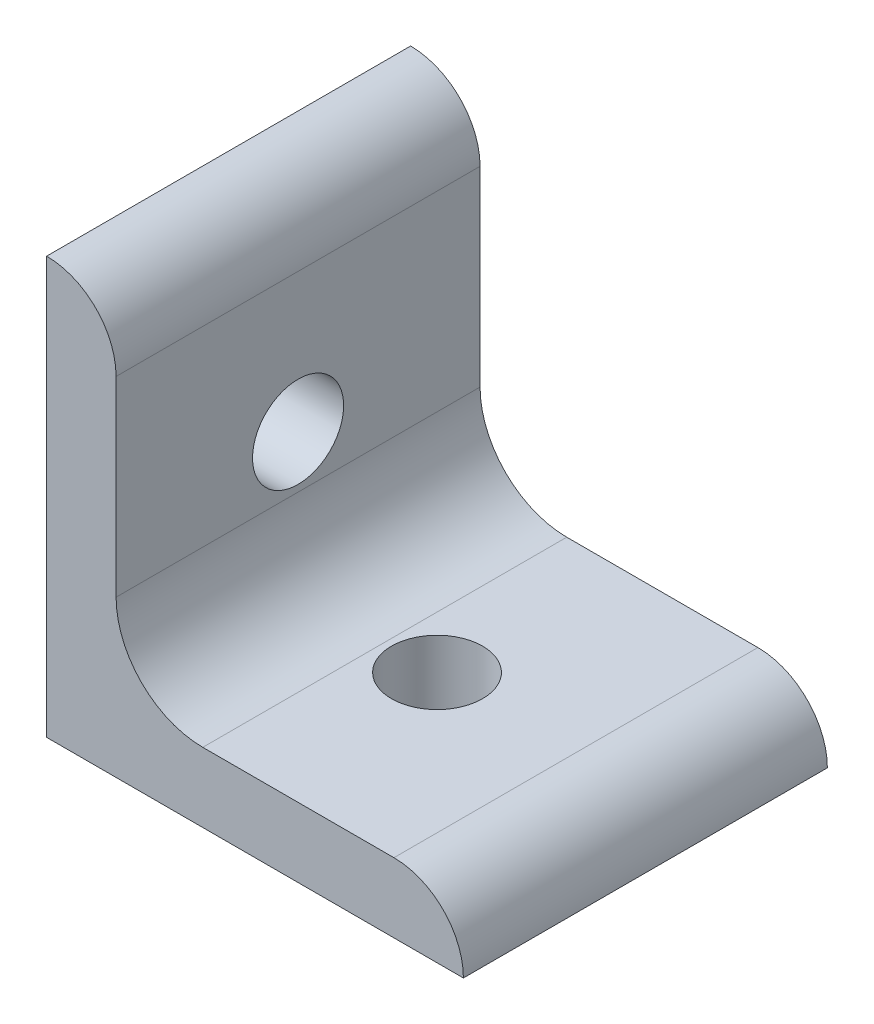
ISO-10303-21;
HEADER;
FILE_DESCRIPTION(('STEP AP214'),'2;1');
FILE_NAME('part.step','',(''),(''),'','','');
FILE_SCHEMA(('AUTOMOTIVE_DESIGN { 1 0 10303 214 1 1 1 1 }'));
ENDSEC;
DATA;
#1=APPLICATION_CONTEXT('core data for automotive mechanical design processes');
#2=APPLICATION_PROTOCOL_DEFINITION('international standard','automotive_design',2000,#1);
#3=PRODUCT_CONTEXT('',#1,'mechanical');
#4=PRODUCT('Part','Part','',(#3));
#5=PRODUCT_RELATED_PRODUCT_CATEGORY('part','',(#4));
#6=PRODUCT_DEFINITION_FORMATION('','',#4);
#7=PRODUCT_DEFINITION_CONTEXT('part definition',#1,'design');
#8=PRODUCT_DEFINITION('design','',#6,#7);
#9=PRODUCT_DEFINITION_SHAPE('','',#8);
#10=(LENGTH_UNIT() NAMED_UNIT(*) SI_UNIT(.MILLI.,.METRE.));
#11=(NAMED_UNIT(*) PLANE_ANGLE_UNIT() SI_UNIT($,.RADIAN.));
#12=(NAMED_UNIT(*) SI_UNIT($,.STERADIAN.) SOLID_ANGLE_UNIT());
#13=UNCERTAINTY_MEASURE_WITH_UNIT(LENGTH_MEASURE(1.E-05),#10,'distance_accuracy_value','');
#14=(GEOMETRIC_REPRESENTATION_CONTEXT(3) GLOBAL_UNCERTAINTY_ASSIGNED_CONTEXT((#13)) GLOBAL_UNIT_ASSIGNED_CONTEXT((#10,
#11,#12)) REPRESENTATION_CONTEXT('',''));
#15=CARTESIAN_POINT('',(0.,0.,0.));
#16=DIRECTION('',(0.,0.,1.));
#17=DIRECTION('',(1.,0.,0.));
#18=AXIS2_PLACEMENT_3D('',#15,#16,#17);
#19=CARTESIAN_POINT('',(6.35,31.75,16.637));
#20=DIRECTION('',(-1.,0.,0.));
#21=DIRECTION('',(0.,-1.,0.));
#22=AXIS2_PLACEMENT_3D('',#19,#20,#21);
#23=PLANE('',#22);
#24=DIRECTION('',(0.,1.,0.));
#25=VECTOR('',#24,1.);
#26=CARTESIAN_POINT('',(6.35,31.75,-16.637));
#27=LINE('',#26,#25);
#28=CARTESIAN_POINT('',(6.35,14.2748,-16.637));
#29=VERTEX_POINT('',#28);
#30=CARTESIAN_POINT('',(6.35,31.75,-16.637));
#31=VERTEX_POINT('',#30);
#32=EDGE_CURVE('E136',#29,#31,#27,.T.);
#33=ORIENTED_EDGE('',*,*,#32,.T.);
#34=DIRECTION('',(0.,0.,-1.));
#35=VECTOR('',#34,1.);
#36=CARTESIAN_POINT('',(6.35,31.75,16.637));
#37=LINE('',#36,#35);
#38=CARTESIAN_POINT('',(6.35,31.75,16.637));
#39=VERTEX_POINT('',#38);
#40=EDGE_CURVE('E133',#39,#31,#37,.T.);
#41=ORIENTED_EDGE('',*,*,#40,.F.);
#42=DIRECTION('',(0.,1.,0.));
#43=VECTOR('',#42,1.);
#44=CARTESIAN_POINT('',(6.35,31.75,16.637));
#45=LINE('',#44,#43);
#46=CARTESIAN_POINT('',(6.35,14.2748,16.637));
#47=VERTEX_POINT('',#46);
#48=EDGE_CURVE('E121',#47,#39,#45,.T.);
#49=ORIENTED_EDGE('',*,*,#48,.F.);
#50=DIRECTION('',(0.,0.,-1.));
#51=VECTOR('',#50,1.);
#52=CARTESIAN_POINT('',(6.35,14.2748,16.637));
#53=LINE('',#52,#51);
#54=EDGE_CURVE('E138',#47,#29,#53,.T.);
#55=ORIENTED_EDGE('',*,*,#54,.T.);
#56=EDGE_LOOP('',(#33,#41,#49,#55));
#57=FACE_BOUND('',#56,.T.);
#58=CARTESIAN_POINT('',(6.34999999999999,19.05,0.));
#59=DIRECTION('',(-1.,0.,0.));
#60=DIRECTION('',(0.,-1.,0.));
#61=AXIS2_PLACEMENT_3D('',#58,#59,#60);
#62=CIRCLE('',#61,4.1656);
#63=CARTESIAN_POINT('',(6.34999999999999,19.05,4.1656));
#64=VERTEX_POINT('',#63);
#65=EDGE_CURVE('E206',#64,#64,#62,.F.);
#66=ORIENTED_EDGE('',*,*,#65,.F.);
#67=EDGE_LOOP('',(#66));
#68=FACE_BOUND('',#67,.T.);
#69=ADVANCED_FACE('F38',(#57,#68),#23,.F.);
#70=CARTESIAN_POINT('',(0.,0.,16.637));
#71=DIRECTION('',(1.,0.,0.));
#72=DIRECTION('',(0.,0.,-1.));
#73=AXIS2_PLACEMENT_3D('',#70,#71,#72);
#74=PLANE('',#73);
#75=DIRECTION('',(0.,-1.,0.));
#76=VECTOR('',#75,1.);
#77=CARTESIAN_POINT('',(0.,0.,-16.637));
#78=LINE('',#77,#76);
#79=CARTESIAN_POINT('',(0.,38.1,-16.637));
#80=VERTEX_POINT('',#79);
#81=CARTESIAN_POINT('',(0.,0.,-16.637));
#82=VERTEX_POINT('',#81);
#83=EDGE_CURVE('E100',#80,#82,#78,.T.);
#84=ORIENTED_EDGE('',*,*,#83,.T.);
#85=DIRECTION('',(0.,0.,-1.));
#86=VECTOR('',#85,1.);
#87=CARTESIAN_POINT('',(0.,0.,16.637));
#88=LINE('',#87,#86);
#89=CARTESIAN_POINT('',(0.,0.,16.637));
#90=VERTEX_POINT('',#89);
#91=EDGE_CURVE('E146',#90,#82,#88,.T.);
#92=ORIENTED_EDGE('',*,*,#91,.F.);
#93=DIRECTION('',(0.,-1.,0.));
#94=VECTOR('',#93,1.);
#95=CARTESIAN_POINT('',(0.,0.,16.637));
#96=LINE('',#95,#94);
#97=CARTESIAN_POINT('',(0.,38.1,16.637));
#98=VERTEX_POINT('',#97);
#99=EDGE_CURVE('E60',#98,#90,#96,.T.);
#100=ORIENTED_EDGE('',*,*,#99,.F.);
#101=DIRECTION('',(0.,0.,-1.));
#102=VECTOR('',#101,1.);
#103=CARTESIAN_POINT('',(0.,38.1,16.637));
#104=LINE('',#103,#102);
#105=EDGE_CURVE('E139',#98,#80,#104,.T.);
#106=ORIENTED_EDGE('',*,*,#105,.T.);
#107=EDGE_LOOP('',(#84,#92,#100,#106));
#108=FACE_BOUND('',#107,.T.);
#109=CARTESIAN_POINT('',(0.,19.05,0.));
#110=DIRECTION('',(1.,0.,0.));
#111=DIRECTION('',(0.,0.,-1.));
#112=AXIS2_PLACEMENT_3D('',#109,#110,#111);
#113=CIRCLE('',#112,4.1656);
#114=CARTESIAN_POINT('',(0.,19.05,4.1656));
#115=VERTEX_POINT('',#114);
#116=EDGE_CURVE('E210',#115,#115,#113,.T.);
#117=ORIENTED_EDGE('',*,*,#116,.T.);
#118=EDGE_LOOP('',(#117));
#119=FACE_BOUND('',#118,.T.);
#120=ADVANCED_FACE('F215',(#108,#119),#74,.F.);
#121=CARTESIAN_POINT('',(38.1,0.,16.637));
#122=DIRECTION('',(0.,1.,0.));
#123=DIRECTION('',(-1.,0.,0.));
#124=AXIS2_PLACEMENT_3D('',#121,#122,#123);
#125=PLANE('',#124);
#126=DIRECTION('',(1.,0.,0.));
#127=VECTOR('',#126,1.);
#128=CARTESIAN_POINT('',(38.1,0.,-16.637));
#129=LINE('',#128,#127);
#130=CARTESIAN_POINT('',(38.1,0.,-16.637));
#131=VERTEX_POINT('',#130);
#132=EDGE_CURVE('E150',#82,#131,#129,.T.);
#133=ORIENTED_EDGE('',*,*,#132,.T.);
#134=DIRECTION('',(0.,0.,-1.));
#135=VECTOR('',#134,1.);
#136=CARTESIAN_POINT('',(38.1,0.,16.637));
#137=LINE('',#136,#135);
#138=CARTESIAN_POINT('',(38.1,0.,16.637));
#139=VERTEX_POINT('',#138);
#140=EDGE_CURVE('E11',#139,#131,#137,.T.);
#141=ORIENTED_EDGE('',*,*,#140,.F.);
#142=DIRECTION('',(1.,0.,0.));
#143=VECTOR('',#142,1.);
#144=CARTESIAN_POINT('',(38.1,0.,16.637));
#145=LINE('',#144,#143);
#146=EDGE_CURVE('E169',#90,#139,#145,.T.);
#147=ORIENTED_EDGE('',*,*,#146,.F.);
#148=ORIENTED_EDGE('',*,*,#91,.T.);
#149=EDGE_LOOP('',(#133,#141,#147,#148));
#150=FACE_BOUND('',#149,.T.);
#151=CARTESIAN_POINT('',(19.05,0.,0.));
#152=DIRECTION('',(0.,1.,0.));
#153=DIRECTION('',(0.,0.,1.));
#154=AXIS2_PLACEMENT_3D('',#151,#152,#153);
#155=CIRCLE('',#154,4.1656);
#156=CARTESIAN_POINT('',(19.05,0.,-4.1656));
#157=VERTEX_POINT('',#156);
#158=EDGE_CURVE('E202',#157,#157,#155,.T.);
#159=ORIENTED_EDGE('',*,*,#158,.T.);
#160=EDGE_LOOP('',(#159));
#161=FACE_BOUND('',#160,.T.);
#162=ADVANCED_FACE('F40',(#150,#161),#125,.F.);
#163=CARTESIAN_POINT('',(14.2748,6.35000000000001,16.637));
#164=DIRECTION('',(0.,-1.,0.));
#165=DIRECTION('',(1.,0.,0.));
#166=AXIS2_PLACEMENT_3D('',#163,#164,#165);
#167=PLANE('',#166);
#168=DIRECTION('',(-1.,0.,0.));
#169=VECTOR('',#168,1.);
#170=CARTESIAN_POINT('',(14.2748,6.35000000000001,-16.637));
#171=LINE('',#170,#169);
#172=CARTESIAN_POINT('',(31.75,6.34999999999999,-16.637));
#173=VERTEX_POINT('',#172);
#174=CARTESIAN_POINT('',(14.2748,6.35000000000001,-16.637));
#175=VERTEX_POINT('',#174);
#176=EDGE_CURVE('E157',#173,#175,#171,.T.);
#177=ORIENTED_EDGE('',*,*,#176,.T.);
#178=DIRECTION('',(0.,0.,-1.));
#179=VECTOR('',#178,1.);
#180=CARTESIAN_POINT('',(14.2748,6.35000000000001,16.637));
#181=LINE('',#180,#179);
#182=CARTESIAN_POINT('',(14.2748,6.35000000000001,16.637));
#183=VERTEX_POINT('',#182);
#184=EDGE_CURVE('E175',#183,#175,#181,.T.);
#185=ORIENTED_EDGE('',*,*,#184,.F.);
#186=DIRECTION('',(-1.,0.,0.));
#187=VECTOR('',#186,1.);
#188=CARTESIAN_POINT('',(14.2748,6.35000000000001,16.637));
#189=LINE('',#188,#187);
#190=CARTESIAN_POINT('',(31.75,6.34999999999999,16.637));
#191=VERTEX_POINT('',#190);
#192=EDGE_CURVE('E188',#191,#183,#189,.T.);
#193=ORIENTED_EDGE('',*,*,#192,.F.);
#194=DIRECTION('',(0.,0.,-1.));
#195=VECTOR('',#194,1.);
#196=CARTESIAN_POINT('',(31.75,6.34999999999999,16.637));
#197=LINE('',#196,#195);
#198=EDGE_CURVE('E49',#191,#173,#197,.T.);
#199=ORIENTED_EDGE('',*,*,#198,.T.);
#200=EDGE_LOOP('',(#177,#185,#193,#199));
#201=FACE_BOUND('',#200,.T.);
#202=CARTESIAN_POINT('',(19.05,6.35000000000001,0.));
#203=DIRECTION('',(0.,-1.,0.));
#204=DIRECTION('',(1.,0.,0.));
#205=AXIS2_PLACEMENT_3D('',#202,#203,#204);
#206=CIRCLE('',#205,4.1656);
#207=CARTESIAN_POINT('',(19.05,6.35000000000001,-4.1656));
#208=VERTEX_POINT('',#207);
#209=EDGE_CURVE('E42',#208,#208,#206,.F.);
#210=ORIENTED_EDGE('',*,*,#209,.F.);
#211=EDGE_LOOP('',(#210));
#212=FACE_BOUND('',#211,.T.);
#213=ADVANCED_FACE('F185',(#201,#212),#167,.F.);
#214=CARTESIAN_POINT('',(31.75,0.,16.637));
#215=DIRECTION('',(0.,0.,-1.));
#216=DIRECTION('',(-1.,0.,0.));
#217=AXIS2_PLACEMENT_3D('',#214,#215,#216);
#218=CYLINDRICAL_SURFACE('',#217,6.34999999999999);
#219=CARTESIAN_POINT('',(31.75,0.,-16.637));
#220=DIRECTION('',(0.,0.,1.));
#221=DIRECTION('',(1.,0.,0.));
#222=AXIS2_PLACEMENT_3D('',#219,#220,#221);
#223=CIRCLE('',#222,6.34999999999999);
#224=EDGE_CURVE('E154',#131,#173,#223,.T.);
#225=ORIENTED_EDGE('',*,*,#224,.T.);
#226=ORIENTED_EDGE('',*,*,#198,.F.);
#227=CARTESIAN_POINT('',(31.75,0.,16.637));
#228=DIRECTION('',(0.,0.,1.));
#229=DIRECTION('',(1.,0.,0.));
#230=AXIS2_PLACEMENT_3D('',#227,#228,#229);
#231=CIRCLE('',#230,6.34999999999999);
#232=EDGE_CURVE('E110',#139,#191,#231,.T.);
#233=ORIENTED_EDGE('',*,*,#232,.F.);
#234=ORIENTED_EDGE('',*,*,#140,.T.);
#235=EDGE_LOOP('',(#225,#226,#233,#234));
#236=FACE_BOUND('',#235,.T.);
#237=ADVANCED_FACE('F233',(#236),#218,.T.);
#238=CARTESIAN_POINT('',(14.2748,14.2748,16.637));
#239=DIRECTION('',(0.,0.,-1.));
#240=DIRECTION('',(-1.,0.,0.));
#241=AXIS2_PLACEMENT_3D('',#238,#239,#240);
#242=CYLINDRICAL_SURFACE('',#241,7.9248);
#243=CARTESIAN_POINT('',(14.2748,14.2748,-16.637));
#244=DIRECTION('',(0.,0.,-1.));
#245=DIRECTION('',(1.,0.,0.));
#246=AXIS2_PLACEMENT_3D('',#243,#244,#245);
#247=CIRCLE('',#246,7.9248);
#248=EDGE_CURVE('E160',#175,#29,#247,.T.);
#249=ORIENTED_EDGE('',*,*,#248,.T.);
#250=ORIENTED_EDGE('',*,*,#54,.F.);
#251=CARTESIAN_POINT('',(14.2748,14.2748,16.637));
#252=DIRECTION('',(0.,0.,-1.));
#253=DIRECTION('',(1.,0.,0.));
#254=AXIS2_PLACEMENT_3D('',#251,#252,#253);
#255=CIRCLE('',#254,7.9248);
#256=EDGE_CURVE('E127',#183,#47,#255,.T.);
#257=ORIENTED_EDGE('',*,*,#256,.F.);
#258=ORIENTED_EDGE('',*,*,#184,.T.);
#259=EDGE_LOOP('',(#249,#250,#257,#258));
#260=FACE_BOUND('',#259,.T.);
#261=ADVANCED_FACE('F194',(#260),#242,.F.);
#262=CARTESIAN_POINT('',(0.,31.75,16.637));
#263=DIRECTION('',(0.,0.,-1.));
#264=DIRECTION('',(-1.,0.,0.));
#265=AXIS2_PLACEMENT_3D('',#262,#263,#264);
#266=CYLINDRICAL_SURFACE('',#265,6.35000000000001);
#267=CARTESIAN_POINT('',(0.,31.75,-16.637));
#268=DIRECTION('',(0.,0.,1.));
#269=DIRECTION('',(1.,0.,0.));
#270=AXIS2_PLACEMENT_3D('',#267,#268,#269);
#271=CIRCLE('',#270,6.35000000000001);
#272=EDGE_CURVE('E93',#31,#80,#271,.T.);
#273=ORIENTED_EDGE('',*,*,#272,.T.);
#274=ORIENTED_EDGE('',*,*,#105,.F.);
#275=CARTESIAN_POINT('',(0.,31.75,16.637));
#276=DIRECTION('',(0.,0.,1.));
#277=DIRECTION('',(1.,0.,0.));
#278=AXIS2_PLACEMENT_3D('',#275,#276,#277);
#279=CIRCLE('',#278,6.35000000000001);
#280=EDGE_CURVE('E125',#39,#98,#279,.T.);
#281=ORIENTED_EDGE('',*,*,#280,.F.);
#282=ORIENTED_EDGE('',*,*,#40,.T.);
#283=EDGE_LOOP('',(#273,#274,#281,#282));
#284=FACE_BOUND('',#283,.T.);
#285=ADVANCED_FACE('F141',(#284),#266,.T.);
#286=CARTESIAN_POINT('',(0.,31.75,16.637));
#287=DIRECTION('',(0.,0.,1.));
#288=DIRECTION('',(1.,0.,0.));
#289=AXIS2_PLACEMENT_3D('',#286,#287,#288);
#290=PLANE('',#289);
#291=ORIENTED_EDGE('',*,*,#146,.T.);
#292=ORIENTED_EDGE('',*,*,#232,.T.);
#293=ORIENTED_EDGE('',*,*,#192,.T.);
#294=ORIENTED_EDGE('',*,*,#256,.T.);
#295=ORIENTED_EDGE('',*,*,#48,.T.);
#296=ORIENTED_EDGE('',*,*,#280,.T.);
#297=ORIENTED_EDGE('',*,*,#99,.T.);
#298=EDGE_LOOP('',(#291,#292,#293,#294,#295,#296,#297));
#299=FACE_BOUND('',#298,.T.);
#300=ADVANCED_FACE('F123',(#299),#290,.T.);
#301=CARTESIAN_POINT('',(0.,31.75,-16.637));
#302=DIRECTION('',(0.,0.,1.));
#303=DIRECTION('',(1.,0.,0.));
#304=AXIS2_PLACEMENT_3D('',#301,#302,#303);
#305=PLANE('',#304);
#306=ORIENTED_EDGE('',*,*,#132,.F.);
#307=ORIENTED_EDGE('',*,*,#83,.F.);
#308=ORIENTED_EDGE('',*,*,#272,.F.);
#309=ORIENTED_EDGE('',*,*,#32,.F.);
#310=ORIENTED_EDGE('',*,*,#248,.F.);
#311=ORIENTED_EDGE('',*,*,#176,.F.);
#312=ORIENTED_EDGE('',*,*,#224,.F.);
#313=EDGE_LOOP('',(#306,#307,#308,#309,#310,#311,#312));
#314=FACE_BOUND('',#313,.T.);
#315=ADVANCED_FACE('F192',(#314),#305,.F.);
#316=CARTESIAN_POINT('',(19.05,38.1,0.));
#317=DIRECTION('',(0.,-1.,0.));
#318=DIRECTION('',(0.,0.,-1.));
#319=AXIS2_PLACEMENT_3D('',#316,#317,#318);
#320=CYLINDRICAL_SURFACE('',#319,4.1656);
#321=CARTESIAN_POINT('',(19.05,0.,-4.1656));
#322=CARTESIAN_POINT('',(19.05,0.0661458333333341,-4.1656));
#323=CARTESIAN_POINT('',(19.05,0.132291666666668,-4.1656));
#324=CARTESIAN_POINT('',(19.05,0.264583333333334,-4.1656));
#325=CARTESIAN_POINT('',(19.05,0.330729166666666,-4.1656));
#326=CARTESIAN_POINT('',(19.05,0.463020833333332,-4.1656));
#327=CARTESIAN_POINT('',(19.05,0.529166666666666,-4.1656));
#328=CARTESIAN_POINT('',(19.05,0.661458333333334,-4.1656));
#329=CARTESIAN_POINT('',(19.05,0.727604166666669,-4.1656));
#330=CARTESIAN_POINT('',(19.05,0.859895833333335,-4.1656));
#331=CARTESIAN_POINT('',(19.05,0.926041666666666,-4.1656));
#332=CARTESIAN_POINT('',(19.05,1.05833333333333,-4.1656));
#333=CARTESIAN_POINT('',(19.05,1.12447916666667,-4.1656));
#334=CARTESIAN_POINT('',(19.05,1.25677083333333,-4.1656));
#335=CARTESIAN_POINT('',(19.05,1.32291666666667,-4.1656));
#336=CARTESIAN_POINT('',(19.05,1.45520833333334,-4.1656));
#337=CARTESIAN_POINT('',(19.05,1.52135416666667,-4.1656));
#338=CARTESIAN_POINT('',(19.05,1.65364583333334,-4.1656));
#339=CARTESIAN_POINT('',(19.05,1.71979166666667,-4.1656));
#340=CARTESIAN_POINT('',(19.05,1.85208333333334,-4.1656));
#341=CARTESIAN_POINT('',(19.05,1.91822916666667,-4.1656));
#342=CARTESIAN_POINT('',(19.05,2.05052083333334,-4.1656));
#343=CARTESIAN_POINT('',(19.05,2.11666666666667,-4.1656));
#344=CARTESIAN_POINT('',(19.05,2.24895833333334,-4.1656));
#345=CARTESIAN_POINT('',(19.05,2.31510416666667,-4.1656));
#346=CARTESIAN_POINT('',(19.05,2.44739583333334,-4.1656));
#347=CARTESIAN_POINT('',(19.05,2.51354166666667,-4.1656));
#348=CARTESIAN_POINT('',(19.05,2.64583333333334,-4.1656));
#349=CARTESIAN_POINT('',(19.05,2.71197916666667,-4.1656));
#350=CARTESIAN_POINT('',(19.05,2.84427083333334,-4.1656));
#351=CARTESIAN_POINT('',(19.05,2.91041666666667,-4.1656));
#352=CARTESIAN_POINT('',(19.05,3.04270833333334,-4.1656));
#353=CARTESIAN_POINT('',(19.05,3.10885416666667,-4.1656));
#354=CARTESIAN_POINT('',(19.05,3.24114583333334,-4.1656));
#355=CARTESIAN_POINT('',(19.05,3.30729166666667,-4.1656));
#356=CARTESIAN_POINT('',(19.05,3.43958333333334,-4.1656));
#357=CARTESIAN_POINT('',(19.05,3.50572916666667,-4.1656));
#358=CARTESIAN_POINT('',(19.05,3.63802083333334,-4.1656));
#359=CARTESIAN_POINT('',(19.05,3.70416666666667,-4.1656));
#360=CARTESIAN_POINT('',(19.05,3.83645833333334,-4.1656));
#361=CARTESIAN_POINT('',(19.05,3.90260416666667,-4.1656));
#362=CARTESIAN_POINT('',(19.05,4.03489583333334,-4.1656));
#363=CARTESIAN_POINT('',(19.05,4.10104166666667,-4.1656));
#364=CARTESIAN_POINT('',(19.05,4.23333333333334,-4.1656));
#365=CARTESIAN_POINT('',(19.05,4.29947916666667,-4.1656));
#366=CARTESIAN_POINT('',(19.05,4.43177083333334,-4.1656));
#367=CARTESIAN_POINT('',(19.05,4.49791666666667,-4.1656));
#368=CARTESIAN_POINT('',(19.05,4.63020833333334,-4.1656));
#369=CARTESIAN_POINT('',(19.05,4.69635416666667,-4.1656));
#370=CARTESIAN_POINT('',(19.05,4.82864583333334,-4.1656));
#371=CARTESIAN_POINT('',(19.05,4.89479166666667,-4.1656));
#372=CARTESIAN_POINT('',(19.05,5.02708333333334,-4.1656));
#373=CARTESIAN_POINT('',(19.05,5.09322916666667,-4.1656));
#374=CARTESIAN_POINT('',(19.05,5.22552083333334,-4.1656));
#375=CARTESIAN_POINT('',(19.05,5.29166666666667,-4.1656));
#376=CARTESIAN_POINT('',(19.05,5.42395833333334,-4.1656));
#377=CARTESIAN_POINT('',(19.05,5.49010416666667,-4.1656));
#378=CARTESIAN_POINT('',(19.05,5.62239583333334,-4.1656));
#379=CARTESIAN_POINT('',(19.05,5.68854166666667,-4.1656));
#380=CARTESIAN_POINT('',(19.05,5.82083333333334,-4.1656));
#381=CARTESIAN_POINT('',(19.05,5.88697916666668,-4.1656));
#382=CARTESIAN_POINT('',(19.05,6.01927083333334,-4.1656));
#383=CARTESIAN_POINT('',(19.05,6.08541666666667,-4.1656));
#384=CARTESIAN_POINT('',(19.05,6.21770833333334,-4.1656));
#385=CARTESIAN_POINT('',(19.05,6.28385416666667,-4.1656));
#386=CARTESIAN_POINT('',(19.05,6.35000000000001,-4.1656));
#387=B_SPLINE_CURVE_WITH_KNOTS('',3,(#321,#322,#323,#324,#325,#326,#327,#328,#329,#330,#331,
#332,#333,#334,#335,#336,#337,#338,#339,#340,#341,#342,#343,#344,#345,#346,#347,#348,#349,#350,
#351,#352,#353,#354,#355,#356,#357,#358,#359,#360,#361,#362,#363,#364,#365,#366,#367,#368,#369,
#370,#371,#372,#373,#374,#375,#376,#377,#378,#379,#380,#381,#382,#383,#384,#385,#386),
.UNSPECIFIED.,.F.,.F.,(4,2,2,2,2,2,2,2,2,2,2,2,2,2,2,2,2,2,2,2,2,2,2,2,2,2,2,2,2,2,2,2,4),(0.,
0.198437500000002,0.396874999999998,0.5953125,0.793750000000003,0.992187499999998,1.190625,
1.3890625,1.58750000000001,1.7859375,1.984375,2.18281250000001,2.38125,2.5796875,
2.77812500000001,2.9765625,3.175,3.37343750000001,3.571875,3.7703125,3.96875000000001,4.1671875,
4.365625,4.56406250000001,4.7625,4.96093750000001,5.15937500000001,5.3578125,5.55625000000001,
5.75468750000001,5.95312500000001,6.15156250000001,6.35000000000001),.UNSPECIFIED.);
#388=EDGE_CURVE('BSEAM220',#157,#208,#387,.T.);
#389=ORIENTED_EDGE('',*,*,#158,.F.);
#390=ORIENTED_EDGE('',*,*,#209,.T.);
#391=ORIENTED_EDGE('',*,*,#388,.T.);
#392=ORIENTED_EDGE('',*,*,#388,.F.);
#393=EDGE_LOOP('',(#389,#391,#390,#392));
#394=FACE_BOUND('',#393,.T.);
#395=ADVANCED_FACE('F220',(#394),#320,.F.);
#396=CARTESIAN_POINT('',(38.1,19.05,0.));
#397=DIRECTION('',(-1.,0.,0.));
#398=DIRECTION('',(0.,0.,1.));
#399=AXIS2_PLACEMENT_3D('',#396,#397,#398);
#400=CYLINDRICAL_SURFACE('',#399,4.1656);
#401=CARTESIAN_POINT('',(0.,19.05,4.1656));
#402=CARTESIAN_POINT('',(0.0661458333333341,19.05,4.1656));
#403=CARTESIAN_POINT('',(0.132291666666668,19.05,4.1656));
#404=CARTESIAN_POINT('',(0.264583333333334,19.05,4.1656));
#405=CARTESIAN_POINT('',(0.330729166666666,19.05,4.1656));
#406=CARTESIAN_POINT('',(0.463020833333332,19.05,4.1656));
#407=CARTESIAN_POINT('',(0.529166666666666,19.05,4.1656));
#408=CARTESIAN_POINT('',(0.661458333333332,19.05,4.1656));
#409=CARTESIAN_POINT('',(0.727604166666664,19.05,4.1656));
#410=CARTESIAN_POINT('',(0.85989583333333,19.05,4.1656));
#411=CARTESIAN_POINT('',(0.926041666666664,19.05,4.1656));
#412=CARTESIAN_POINT('',(1.05833333333333,19.05,4.1656));
#413=CARTESIAN_POINT('',(1.12447916666667,19.05,4.1656));
#414=CARTESIAN_POINT('',(1.25677083333333,19.05,4.1656));
#415=CARTESIAN_POINT('',(1.32291666666666,19.05,4.1656));
#416=CARTESIAN_POINT('',(1.45520833333333,19.05,4.1656));
#417=CARTESIAN_POINT('',(1.52135416666666,19.05,4.1656));
#418=CARTESIAN_POINT('',(1.65364583333333,19.05,4.1656));
#419=CARTESIAN_POINT('',(1.71979166666667,19.05,4.1656));
#420=CARTESIAN_POINT('',(1.85208333333333,19.05,4.1656));
#421=CARTESIAN_POINT('',(1.91822916666666,19.05,4.1656));
#422=CARTESIAN_POINT('',(2.05052083333333,19.05,4.1656));
#423=CARTESIAN_POINT('',(2.11666666666666,19.05,4.1656));
#424=CARTESIAN_POINT('',(2.24895833333333,19.05,4.1656));
#425=CARTESIAN_POINT('',(2.31510416666667,19.05,4.1656));
#426=CARTESIAN_POINT('',(2.44739583333333,19.05,4.1656));
#427=CARTESIAN_POINT('',(2.51354166666667,19.05,4.1656));
#428=CARTESIAN_POINT('',(2.64583333333333,19.05,4.1656));
#429=CARTESIAN_POINT('',(2.71197916666667,19.05,4.1656));
#430=CARTESIAN_POINT('',(2.84427083333333,19.05,4.1656));
#431=CARTESIAN_POINT('',(2.91041666666666,19.05,4.1656));
#432=CARTESIAN_POINT('',(3.04270833333333,19.05,4.1656));
#433=CARTESIAN_POINT('',(3.10885416666666,19.05,4.1656));
#434=CARTESIAN_POINT('',(3.24114583333333,19.05,4.1656));
#435=CARTESIAN_POINT('',(3.30729166666667,19.05,4.1656));
#436=CARTESIAN_POINT('',(3.43958333333333,19.05,4.1656));
#437=CARTESIAN_POINT('',(3.50572916666666,19.05,4.1656));
#438=CARTESIAN_POINT('',(3.63802083333333,19.05,4.1656));
#439=CARTESIAN_POINT('',(3.70416666666666,19.05,4.1656));
#440=CARTESIAN_POINT('',(3.83645833333333,19.05,4.1656));
#441=CARTESIAN_POINT('',(3.90260416666666,19.05,4.1656));
#442=CARTESIAN_POINT('',(4.03489583333333,19.05,4.1656));
#443=CARTESIAN_POINT('',(4.10104166666666,19.05,4.1656));
#444=CARTESIAN_POINT('',(4.23333333333333,19.05,4.1656));
#445=CARTESIAN_POINT('',(4.29947916666666,19.05,4.1656));
#446=CARTESIAN_POINT('',(4.43177083333333,19.05,4.1656));
#447=CARTESIAN_POINT('',(4.49791666666666,19.05,4.1656));
#448=CARTESIAN_POINT('',(4.63020833333333,19.05,4.1656));
#449=CARTESIAN_POINT('',(4.69635416666666,19.05,4.1656));
#450=CARTESIAN_POINT('',(4.82864583333333,19.05,4.1656));
#451=CARTESIAN_POINT('',(4.89479166666666,19.05,4.1656));
#452=CARTESIAN_POINT('',(5.02708333333333,19.05,4.1656));
#453=CARTESIAN_POINT('',(5.09322916666666,19.05,4.1656));
#454=CARTESIAN_POINT('',(5.22552083333333,19.05,4.1656));
#455=CARTESIAN_POINT('',(5.29166666666666,19.05,4.1656));
#456=CARTESIAN_POINT('',(5.42395833333333,19.05,4.1656));
#457=CARTESIAN_POINT('',(5.49010416666667,19.05,4.1656));
#458=CARTESIAN_POINT('',(5.62239583333333,19.05,4.1656));
#459=CARTESIAN_POINT('',(5.68854166666666,19.05,4.1656));
#460=CARTESIAN_POINT('',(5.82083333333333,19.05,4.1656));
#461=CARTESIAN_POINT('',(5.88697916666666,19.05,4.1656));
#462=CARTESIAN_POINT('',(6.01927083333333,19.05,4.1656));
#463=CARTESIAN_POINT('',(6.08541666666666,19.05,4.1656));
#464=CARTESIAN_POINT('',(6.21770833333333,19.05,4.1656));
#465=CARTESIAN_POINT('',(6.28385416666666,19.05,4.1656));
#466=CARTESIAN_POINT('',(6.34999999999999,19.05,4.1656));
#467=B_SPLINE_CURVE_WITH_KNOTS('',3,(#401,#402,#403,#404,#405,#406,#407,#408,#409,#410,#411,
#412,#413,#414,#415,#416,#417,#418,#419,#420,#421,#422,#423,#424,#425,#426,#427,#428,#429,#430,
#431,#432,#433,#434,#435,#436,#437,#438,#439,#440,#441,#442,#443,#444,#445,#446,#447,#448,#449,
#450,#451,#452,#453,#454,#455,#456,#457,#458,#459,#460,#461,#462,#463,#464,#465,#466),
.UNSPECIFIED.,.F.,.F.,(4,2,2,2,2,2,2,2,2,2,2,2,2,2,2,2,2,2,2,2,2,2,2,2,2,2,2,2,2,2,2,2,4),(0.,
0.198437500000002,0.396874999999998,0.5953125,0.793749999999996,0.992187499999998,1.190625,
1.3890625,1.5875,1.7859375,1.984375,2.1828125,2.38125,2.5796875,2.778125,2.97656249999999,3.175,
3.3734375,3.571875,3.7703125,3.96874999999999,4.1671875,4.365625,4.56406249999999,4.7625,
4.9609375,5.15937499999999,5.3578125,5.55625,5.75468749999999,5.953125,6.15156249999999,
6.34999999999999),.UNSPECIFIED.);
#468=EDGE_CURVE('BSEAM217',#115,#64,#467,.T.);
#469=ORIENTED_EDGE('',*,*,#116,.F.);
#470=ORIENTED_EDGE('',*,*,#65,.T.);
#471=ORIENTED_EDGE('',*,*,#468,.T.);
#472=ORIENTED_EDGE('',*,*,#468,.F.);
#473=EDGE_LOOP('',(#469,#471,#470,#472));
#474=FACE_BOUND('',#473,.T.);
#475=ADVANCED_FACE('F217',(#474),#400,.F.);
#476=CLOSED_SHELL('',(#69,#120,#162,#213,#237,#261,#285,#300,#315,#395,#475));
#477=MANIFOLD_SOLID_BREP('B2',#476);
#478=ADVANCED_BREP_SHAPE_REPRESENTATION('',(#18,#477),#14);
#479=SHAPE_DEFINITION_REPRESENTATION(#9,#478);
ENDSEC;
END-ISO-10303-21;
